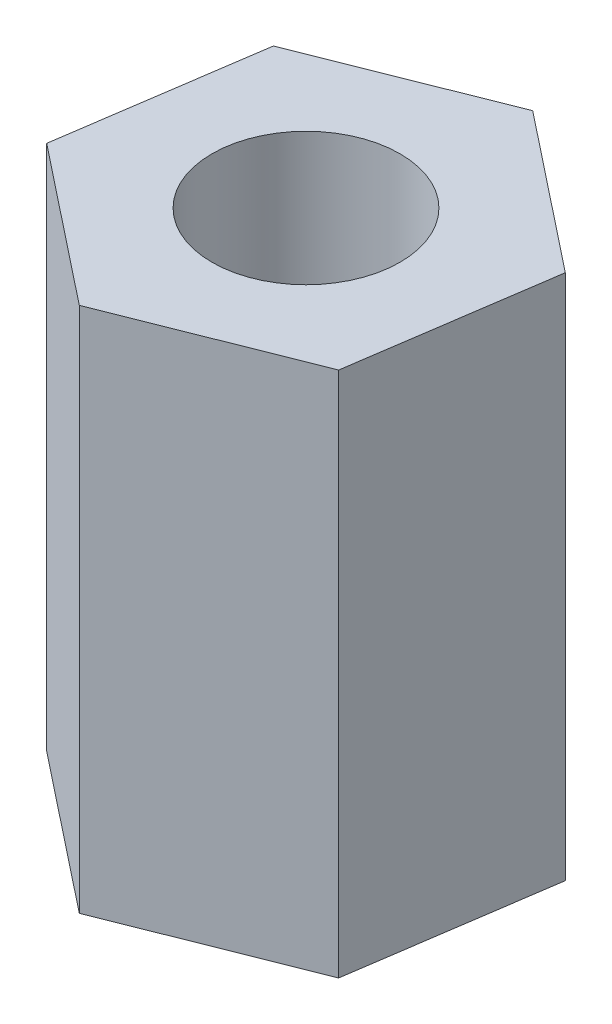
ISO-10303-21;
HEADER;
FILE_DESCRIPTION(('STEP AP214'),'2;1');
FILE_NAME('part.step','',(''),(''),'','','');
FILE_SCHEMA(('AUTOMOTIVE_DESIGN { 1 0 10303 214 1 1 1 1 }'));
ENDSEC;
DATA;
#1=APPLICATION_CONTEXT('core data for automotive mechanical design processes');
#2=APPLICATION_PROTOCOL_DEFINITION('international standard','automotive_design',2000,#1);
#3=PRODUCT_CONTEXT('',#1,'mechanical');
#4=PRODUCT('Part','Part','',(#3));
#5=PRODUCT_RELATED_PRODUCT_CATEGORY('part','',(#4));
#6=PRODUCT_DEFINITION_FORMATION('','',#4);
#7=PRODUCT_DEFINITION_CONTEXT('part definition',#1,'design');
#8=PRODUCT_DEFINITION('design','',#6,#7);
#9=PRODUCT_DEFINITION_SHAPE('','',#8);
#10=(LENGTH_UNIT() NAMED_UNIT(*) SI_UNIT(.MILLI.,.METRE.));
#11=(NAMED_UNIT(*) PLANE_ANGLE_UNIT() SI_UNIT($,.RADIAN.));
#12=(NAMED_UNIT(*) SI_UNIT($,.STERADIAN.) SOLID_ANGLE_UNIT());
#13=UNCERTAINTY_MEASURE_WITH_UNIT(LENGTH_MEASURE(1.E-05),#10,'distance_accuracy_value','');
#14=(GEOMETRIC_REPRESENTATION_CONTEXT(3) GLOBAL_UNCERTAINTY_ASSIGNED_CONTEXT((#13)) GLOBAL_UNIT_ASSIGNED_CONTEXT((#10,
#11,#12)) REPRESENTATION_CONTEXT('',''));
#15=CARTESIAN_POINT('',(0.,0.,0.));
#16=DIRECTION('',(0.,0.,1.));
#17=DIRECTION('',(1.,0.,0.));
#18=AXIS2_PLACEMENT_3D('',#15,#16,#17);
#19=CARTESIAN_POINT('',(-0.386477916077778,7.,2.62754032389945));
#20=DIRECTION('',(-0.368652129532225,0.,-0.929567430255253));
#21=DIRECTION('',(-0.929567430255254,0.,0.368652129532225));
#22=AXIS2_PLACEMENT_3D('',#19,#20,#21);
#23=PLANE('',#22);
#24=DIRECTION('',(0.929567430255254,0.,-0.368652129532225));
#25=VECTOR('',#24,1.);
#26=CARTESIAN_POINT('',(-0.386477916077778,0.,2.62754032389945));
#27=LINE('',#26,#25);
#28=CARTESIAN_POINT('',(-0.386477916077778,0.,2.62754032389945));
#29=VERTEX_POINT('',#28);
#30=CARTESIAN_POINT('',(2.08227771192603,0.,1.64846985527475));
#31=VERTEX_POINT('',#30);
#32=EDGE_CURVE('E116',#29,#31,#27,.T.);
#33=ORIENTED_EDGE('',*,*,#32,.T.);
#34=DIRECTION('',(0.,-1.,0.));
#35=VECTOR('',#34,1.);
#36=CARTESIAN_POINT('',(2.08227771192603,7.,1.64846985527475));
#37=LINE('',#36,#35);
#38=CARTESIAN_POINT('',(2.08227771192603,7.,1.64846985527475));
#39=VERTEX_POINT('',#38);
#40=EDGE_CURVE('E11',#39,#31,#37,.T.);
#41=ORIENTED_EDGE('',*,*,#40,.F.);
#42=DIRECTION('',(0.929567430255254,0.,-0.368652129532225));
#43=VECTOR('',#42,1.);
#44=CARTESIAN_POINT('',(-0.386477916077778,7.,2.62754032389945));
#45=LINE('',#44,#43);
#46=CARTESIAN_POINT('',(-0.386477916077778,7.,2.62754032389945));
#47=VERTEX_POINT('',#46);
#48=EDGE_CURVE('E127',#47,#39,#45,.T.);
#49=ORIENTED_EDGE('',*,*,#48,.F.);
#50=DIRECTION('',(0.,-1.,0.));
#51=VECTOR('',#50,1.);
#52=CARTESIAN_POINT('',(-0.386477916077778,7.,2.62754032389945));
#53=LINE('',#52,#51);
#54=EDGE_CURVE('E112',#47,#29,#53,.T.);
#55=ORIENTED_EDGE('',*,*,#54,.T.);
#56=EDGE_LOOP('',(#33,#41,#49,#55));
#57=FACE_BOUND('',#56,.T.);
#58=ADVANCED_FACE('F32',(#57),#23,.F.);
#59=CARTESIAN_POINT('',(2.08227771192603,7.,1.64846985527475));
#60=DIRECTION('',(-0.989355073897781,0.,-0.145521605793488));
#61=DIRECTION('',(-0.145521605793488,0.,0.989355073897781));
#62=AXIS2_PLACEMENT_3D('',#59,#60,#61);
#63=PLANE('',#62);
#64=DIRECTION('',(0.145521605793488,0.,-0.989355073897781));
#65=VECTOR('',#64,1.);
#66=CARTESIAN_POINT('',(2.08227771192603,0.,1.64846985527475));
#67=LINE('',#66,#65);
#68=CARTESIAN_POINT('',(2.46875562800381,0.,-0.9790704686247));
#69=VERTEX_POINT('',#68);
#70=EDGE_CURVE('E119',#31,#69,#67,.T.);
#71=ORIENTED_EDGE('',*,*,#70,.T.);
#72=DIRECTION('',(0.,-1.,0.));
#73=VECTOR('',#72,1.);
#74=CARTESIAN_POINT('',(2.46875562800381,7.,-0.9790704686247));
#75=LINE('',#74,#73);
#76=CARTESIAN_POINT('',(2.46875562800381,7.,-0.9790704686247));
#77=VERTEX_POINT('',#76);
#78=EDGE_CURVE('E40',#77,#69,#75,.T.);
#79=ORIENTED_EDGE('',*,*,#78,.F.);
#80=DIRECTION('',(0.145521605793488,0.,-0.989355073897781));
#81=VECTOR('',#80,1.);
#82=CARTESIAN_POINT('',(2.08227771192603,7.,1.64846985527475));
#83=LINE('',#82,#81);
#84=EDGE_CURVE('E85',#39,#77,#83,.T.);
#85=ORIENTED_EDGE('',*,*,#84,.F.);
#86=ORIENTED_EDGE('',*,*,#40,.T.);
#87=EDGE_LOOP('',(#71,#79,#85,#86));
#88=FACE_BOUND('',#87,.T.);
#89=ADVANCED_FACE('F152',(#88),#63,.F.);
#90=CARTESIAN_POINT('',(2.46875562800381,7.,-0.9790704686247));
#91=DIRECTION('',(-0.620702944365557,0.,0.784045824461765));
#92=DIRECTION('',(0.784045824461765,0.,0.620702944365557));
#93=AXIS2_PLACEMENT_3D('',#90,#91,#92);
#94=PLANE('',#93);
#95=DIRECTION('',(-0.784045824461765,0.,-0.620702944365557));
#96=VECTOR('',#95,1.);
#97=CARTESIAN_POINT('',(2.46875562800381,0.,-0.9790704686247));
#98=LINE('',#97,#96);
#99=CARTESIAN_POINT('',(0.386477916077779,0.,-2.62754032389945));
#100=VERTEX_POINT('',#99);
#101=EDGE_CURVE('E122',#69,#100,#98,.T.);
#102=ORIENTED_EDGE('',*,*,#101,.T.);
#103=DIRECTION('',(0.,-1.,0.));
#104=VECTOR('',#103,1.);
#105=CARTESIAN_POINT('',(0.386477916077779,7.,-2.62754032389945));
#106=LINE('',#105,#104);
#107=CARTESIAN_POINT('',(0.386477916077779,7.,-2.62754032389945));
#108=VERTEX_POINT('',#107);
#109=EDGE_CURVE('E107',#108,#100,#106,.T.);
#110=ORIENTED_EDGE('',*,*,#109,.F.);
#111=DIRECTION('',(-0.784045824461765,0.,-0.620702944365557));
#112=VECTOR('',#111,1.);
#113=CARTESIAN_POINT('',(2.46875562800381,7.,-0.9790704686247));
#114=LINE('',#113,#112);
#115=EDGE_CURVE('E98',#77,#108,#114,.T.);
#116=ORIENTED_EDGE('',*,*,#115,.F.);
#117=ORIENTED_EDGE('',*,*,#78,.T.);
#118=EDGE_LOOP('',(#102,#110,#116,#117));
#119=FACE_BOUND('',#118,.T.);
#120=ADVANCED_FACE('F133',(#119),#94,.F.);
#121=CARTESIAN_POINT('',(0.386477916077779,7.,-2.62754032389945));
#122=DIRECTION('',(0.368652129532225,0.,0.929567430255253));
#123=DIRECTION('',(0.929567430255254,0.,-0.368652129532225));
#124=AXIS2_PLACEMENT_3D('',#121,#122,#123);
#125=PLANE('',#124);
#126=DIRECTION('',(-0.929567430255254,0.,0.368652129532225));
#127=VECTOR('',#126,1.);
#128=CARTESIAN_POINT('',(0.386477916077779,0.,-2.62754032389945));
#129=LINE('',#128,#127);
#130=CARTESIAN_POINT('',(-2.08227771192603,0.,-1.64846985527475));
#131=VERTEX_POINT('',#130);
#132=EDGE_CURVE('E106',#100,#131,#129,.T.);
#133=ORIENTED_EDGE('',*,*,#132,.T.);
#134=DIRECTION('',(0.,-1.,0.));
#135=VECTOR('',#134,1.);
#136=CARTESIAN_POINT('',(-2.08227771192603,7.,-1.64846985527475));
#137=LINE('',#136,#135);
#138=CARTESIAN_POINT('',(-2.08227771192603,7.,-1.64846985527475));
#139=VERTEX_POINT('',#138);
#140=EDGE_CURVE('E103',#139,#131,#137,.T.);
#141=ORIENTED_EDGE('',*,*,#140,.F.);
#142=DIRECTION('',(-0.929567430255254,0.,0.368652129532225));
#143=VECTOR('',#142,1.);
#144=CARTESIAN_POINT('',(0.386477916077779,7.,-2.62754032389945));
#145=LINE('',#144,#143);
#146=EDGE_CURVE('E92',#108,#139,#145,.T.);
#147=ORIENTED_EDGE('',*,*,#146,.F.);
#148=ORIENTED_EDGE('',*,*,#109,.T.);
#149=EDGE_LOOP('',(#133,#141,#147,#148));
#150=FACE_BOUND('',#149,.T.);
#151=ADVANCED_FACE('F104',(#150),#125,.F.);
#152=CARTESIAN_POINT('',(-2.08227771192603,7.,-1.64846985527475));
#153=DIRECTION('',(0.989355073897782,0.,0.145521605793488));
#154=DIRECTION('',(0.145521605793488,0.,-0.989355073897782));
#155=AXIS2_PLACEMENT_3D('',#152,#153,#154);
#156=PLANE('',#155);
#157=DIRECTION('',(-0.145521605793488,0.,0.989355073897782));
#158=VECTOR('',#157,1.);
#159=CARTESIAN_POINT('',(-2.08227771192603,0.,-1.64846985527475));
#160=LINE('',#159,#158);
#161=CARTESIAN_POINT('',(-2.46875562800381,0.,0.9790704686247));
#162=VERTEX_POINT('',#161);
#163=EDGE_CURVE('E71',#131,#162,#160,.T.);
#164=ORIENTED_EDGE('',*,*,#163,.T.);
#165=DIRECTION('',(0.,-1.,0.));
#166=VECTOR('',#165,1.);
#167=CARTESIAN_POINT('',(-2.46875562800381,7.,0.9790704686247));
#168=LINE('',#167,#166);
#169=CARTESIAN_POINT('',(-2.46875562800381,7.,0.9790704686247));
#170=VERTEX_POINT('',#169);
#171=EDGE_CURVE('E108',#170,#162,#168,.T.);
#172=ORIENTED_EDGE('',*,*,#171,.F.);
#173=DIRECTION('',(-0.145521605793488,0.,0.989355073897782));
#174=VECTOR('',#173,1.);
#175=CARTESIAN_POINT('',(-2.08227771192603,7.,-1.64846985527475));
#176=LINE('',#175,#174);
#177=EDGE_CURVE('E96',#139,#170,#176,.T.);
#178=ORIENTED_EDGE('',*,*,#177,.F.);
#179=ORIENTED_EDGE('',*,*,#140,.T.);
#180=EDGE_LOOP('',(#164,#172,#178,#179));
#181=FACE_BOUND('',#180,.T.);
#182=ADVANCED_FACE('F110',(#181),#156,.F.);
#183=CARTESIAN_POINT('',(-2.46875562800381,7.,0.9790704686247));
#184=DIRECTION('',(0.620702944365556,0.,-0.784045824461765));
#185=DIRECTION('',(-0.784045824461765,0.,-0.620702944365556));
#186=AXIS2_PLACEMENT_3D('',#183,#184,#185);
#187=PLANE('',#186);
#188=DIRECTION('',(0.784045824461765,0.,0.620702944365556));
#189=VECTOR('',#188,1.);
#190=CARTESIAN_POINT('',(-2.46875562800381,0.,0.9790704686247));
#191=LINE('',#190,#189);
#192=EDGE_CURVE('E77',#162,#29,#191,.T.);
#193=ORIENTED_EDGE('',*,*,#192,.T.);
#194=ORIENTED_EDGE('',*,*,#54,.F.);
#195=DIRECTION('',(0.784045824461765,0.,0.620702944365556));
#196=VECTOR('',#195,1.);
#197=CARTESIAN_POINT('',(-2.46875562800381,7.,0.9790704686247));
#198=LINE('',#197,#196);
#199=EDGE_CURVE('E48',#170,#47,#198,.T.);
#200=ORIENTED_EDGE('',*,*,#199,.F.);
#201=ORIENTED_EDGE('',*,*,#171,.T.);
#202=EDGE_LOOP('',(#193,#194,#200,#201));
#203=FACE_BOUND('',#202,.T.);
#204=ADVANCED_FACE('F140',(#203),#187,.F.);
#205=CARTESIAN_POINT('',(0.,7.,0.));
#206=DIRECTION('',(0.,1.,0.));
#207=DIRECTION('',(0.,0.,1.));
#208=AXIS2_PLACEMENT_3D('',#205,#206,#207);
#209=PLANE('',#208);
#210=CARTESIAN_POINT('',(0.,7.,0.));
#211=DIRECTION('',(0.,1.,0.));
#212=DIRECTION('',(0.,0.,1.));
#213=AXIS2_PLACEMENT_3D('',#210,#211,#212);
#214=CIRCLE('',#213,1.25);
#215=CARTESIAN_POINT('',(0.,7.,1.25));
#216=VERTEX_POINT('',#215);
#217=EDGE_CURVE('E207',#216,#216,#214,.T.);
#218=ORIENTED_EDGE('',*,*,#217,.F.);
#219=EDGE_LOOP('',(#218));
#220=FACE_BOUND('',#219,.T.);
#221=ORIENTED_EDGE('',*,*,#48,.T.);
#222=ORIENTED_EDGE('',*,*,#84,.T.);
#223=ORIENTED_EDGE('',*,*,#115,.T.);
#224=ORIENTED_EDGE('',*,*,#146,.T.);
#225=ORIENTED_EDGE('',*,*,#177,.T.);
#226=ORIENTED_EDGE('',*,*,#199,.T.);
#227=EDGE_LOOP('',(#221,#222,#223,#224,#225,#226));
#228=FACE_BOUND('',#227,.T.);
#229=ADVANCED_FACE('F94',(#220,#228),#209,.T.);
#230=CARTESIAN_POINT('',(0.,0.,0.));
#231=DIRECTION('',(0.,1.,0.));
#232=DIRECTION('',(0.,0.,1.));
#233=AXIS2_PLACEMENT_3D('',#230,#231,#232);
#234=PLANE('',#233);
#235=CARTESIAN_POINT('',(0.,0.,0.));
#236=DIRECTION('',(0.,1.,0.));
#237=DIRECTION('',(0.,0.,1.));
#238=AXIS2_PLACEMENT_3D('',#235,#236,#237);
#239=CIRCLE('',#238,1.25);
#240=CARTESIAN_POINT('',(0.,0.,1.25));
#241=VERTEX_POINT('',#240);
#242=EDGE_CURVE('E120',#241,#241,#239,.T.);
#243=ORIENTED_EDGE('',*,*,#242,.T.);
#244=EDGE_LOOP('',(#243));
#245=FACE_BOUND('',#244,.T.);
#246=ORIENTED_EDGE('',*,*,#32,.F.);
#247=ORIENTED_EDGE('',*,*,#192,.F.);
#248=ORIENTED_EDGE('',*,*,#163,.F.);
#249=ORIENTED_EDGE('',*,*,#132,.F.);
#250=ORIENTED_EDGE('',*,*,#101,.F.);
#251=ORIENTED_EDGE('',*,*,#70,.F.);
#252=EDGE_LOOP('',(#246,#247,#248,#249,#250,#251));
#253=FACE_BOUND('',#252,.T.);
#254=ADVANCED_FACE('F136',(#245,#253),#234,.F.);
#255=CARTESIAN_POINT('',(0.,0.,0.));
#256=DIRECTION('',(0.,1.,0.));
#257=DIRECTION('',(0.,0.,1.));
#258=AXIS2_PLACEMENT_3D('',#255,#256,#257);
#259=CYLINDRICAL_SURFACE('',#258,1.25);
#260=ORIENTED_EDGE('',*,*,#242,.F.);
#261=EDGE_LOOP('',(#260));
#262=FACE_BOUND('',#261,.T.);
#263=ORIENTED_EDGE('',*,*,#217,.T.);
#264=EDGE_LOOP('',(#263));
#265=FACE_BOUND('',#264,.T.);
#266=ADVANCED_FACE('F189',(#262,#265),#259,.F.);
#267=CLOSED_SHELL('',(#58,#89,#120,#151,#182,#204,#229,#254,#266));
#268=MANIFOLD_SOLID_BREP('B2',#267);
#269=ADVANCED_BREP_SHAPE_REPRESENTATION('',(#18,#268),#14);
#270=SHAPE_DEFINITION_REPRESENTATION(#9,#269);
ENDSEC;
END-ISO-10303-21;
